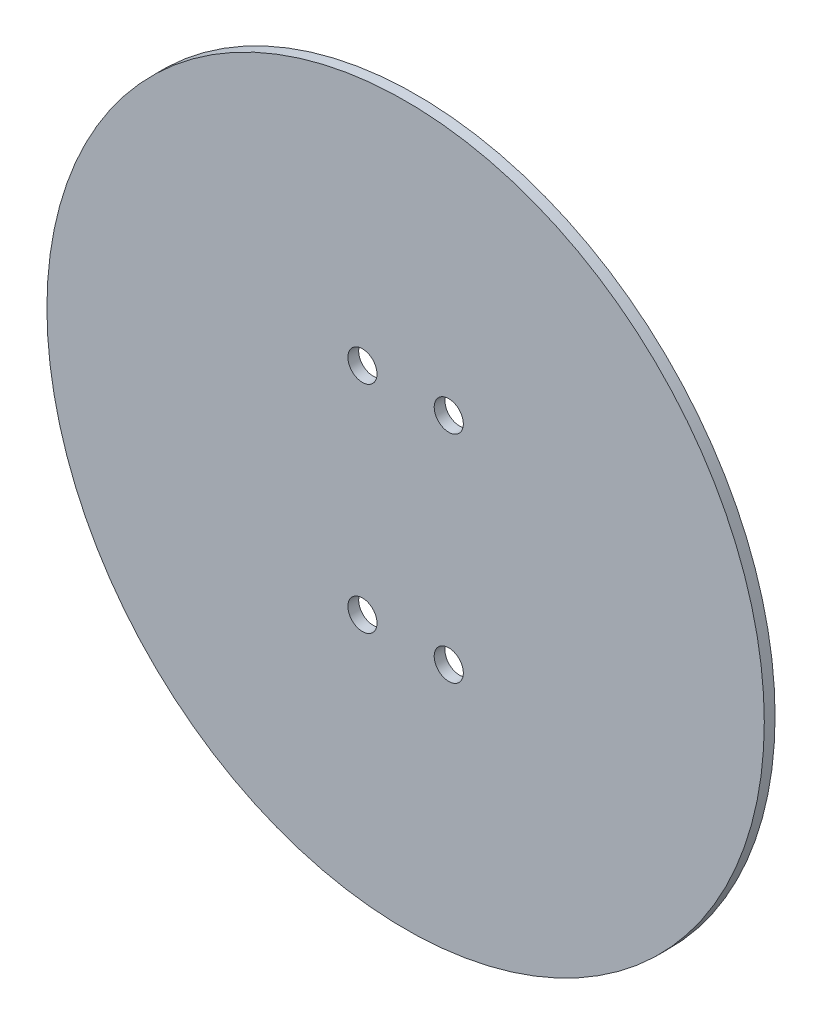
ISO-10303-21;
HEADER;
FILE_DESCRIPTION(('STEP AP214'),'2;1');
FILE_NAME('part.step','',(''),(''),'','','');
FILE_SCHEMA(('AUTOMOTIVE_DESIGN { 1 0 10303 214 1 1 1 1 }'));
ENDSEC;
DATA;
#1=APPLICATION_CONTEXT('core data for automotive mechanical design processes');
#2=APPLICATION_PROTOCOL_DEFINITION('international standard','automotive_design',2000,#1);
#3=PRODUCT_CONTEXT('',#1,'mechanical');
#4=PRODUCT('Part','Part','',(#3));
#5=PRODUCT_RELATED_PRODUCT_CATEGORY('part','',(#4));
#6=PRODUCT_DEFINITION_FORMATION('','',#4);
#7=PRODUCT_DEFINITION_CONTEXT('part definition',#1,'design');
#8=PRODUCT_DEFINITION('design','',#6,#7);
#9=PRODUCT_DEFINITION_SHAPE('','',#8);
#10=(LENGTH_UNIT() NAMED_UNIT(*) SI_UNIT(.MILLI.,.METRE.));
#11=(NAMED_UNIT(*) PLANE_ANGLE_UNIT() SI_UNIT($,.RADIAN.));
#12=(NAMED_UNIT(*) SI_UNIT($,.STERADIAN.) SOLID_ANGLE_UNIT());
#13=UNCERTAINTY_MEASURE_WITH_UNIT(LENGTH_MEASURE(1.E-05),#10,'distance_accuracy_value','');
#14=(GEOMETRIC_REPRESENTATION_CONTEXT(3) GLOBAL_UNCERTAINTY_ASSIGNED_CONTEXT((#13)) GLOBAL_UNIT_ASSIGNED_CONTEXT((#10,
#11,#12)) REPRESENTATION_CONTEXT('',''));
#15=CARTESIAN_POINT('',(0.,0.,0.));
#16=DIRECTION('',(0.,0.,1.));
#17=DIRECTION('',(1.,0.,0.));
#18=AXIS2_PLACEMENT_3D('',#15,#16,#17);
#19=CARTESIAN_POINT('',(0.,0.,2.54));
#20=DIRECTION('',(0.,0.,-1.));
#21=DIRECTION('',(-1.,0.,0.));
#22=AXIS2_PLACEMENT_3D('',#19,#20,#21);
#23=CYLINDRICAL_SURFACE('',#22,84.455);
#24=CARTESIAN_POINT('',(0.,0.,2.54));
#25=DIRECTION('',(0.,0.,1.));
#26=DIRECTION('',(1.,0.,0.));
#27=AXIS2_PLACEMENT_3D('',#24,#25,#26);
#28=CIRCLE('',#27,84.455);
#29=CARTESIAN_POINT('',(84.455,0.,2.54));
#30=VERTEX_POINT('',#29);
#31=EDGE_CURVE('E10',#30,#30,#28,.T.);
#32=ORIENTED_EDGE('',*,*,#31,.F.);
#33=EDGE_LOOP('',(#32));
#34=FACE_BOUND('',#33,.T.);
#35=CARTESIAN_POINT('',(0.,0.,0.));
#36=DIRECTION('',(0.,0.,1.));
#37=DIRECTION('',(1.,0.,0.));
#38=AXIS2_PLACEMENT_3D('',#35,#36,#37);
#39=CIRCLE('',#38,84.455);
#40=CARTESIAN_POINT('',(84.455,0.,0.));
#41=VERTEX_POINT('',#40);
#42=EDGE_CURVE('E46',#41,#41,#39,.T.);
#43=ORIENTED_EDGE('',*,*,#42,.T.);
#44=EDGE_LOOP('',(#43));
#45=FACE_BOUND('',#44,.T.);
#46=ADVANCED_FACE('F43',(#34,#45),#23,.T.);
#47=CARTESIAN_POINT('',(0.,0.,2.54));
#48=DIRECTION('',(0.,0.,1.));
#49=DIRECTION('',(1.,0.,0.));
#50=AXIS2_PLACEMENT_3D('',#47,#48,#49);
#51=PLANE('',#50);
#52=CARTESIAN_POINT('',(-10.16,-25.4,2.54));
#53=DIRECTION('',(0.,0.,1.));
#54=DIRECTION('',(-1.,0.,0.));
#55=AXIS2_PLACEMENT_3D('',#52,#53,#54);
#56=CIRCLE('',#55,3.429);
#57=CARTESIAN_POINT('',(-13.589,-25.4,2.54));
#58=VERTEX_POINT('',#57);
#59=EDGE_CURVE('E69',#58,#58,#56,.T.);
#60=ORIENTED_EDGE('',*,*,#59,.F.);
#61=EDGE_LOOP('',(#60));
#62=FACE_BOUND('',#61,.T.);
#63=CARTESIAN_POINT('',(10.16,-25.4,2.54));
#64=DIRECTION('',(0.,0.,1.));
#65=DIRECTION('',(1.,0.,0.));
#66=AXIS2_PLACEMENT_3D('',#63,#64,#65);
#67=CIRCLE('',#66,3.429);
#68=CARTESIAN_POINT('',(13.589,-25.4,2.54));
#69=VERTEX_POINT('',#68);
#70=EDGE_CURVE('E77',#69,#69,#67,.T.);
#71=ORIENTED_EDGE('',*,*,#70,.F.);
#72=EDGE_LOOP('',(#71));
#73=FACE_BOUND('',#72,.T.);
#74=CARTESIAN_POINT('',(10.16,25.4,2.54));
#75=DIRECTION('',(0.,0.,1.));
#76=DIRECTION('',(-1.,0.,0.));
#77=AXIS2_PLACEMENT_3D('',#74,#75,#76);
#78=CIRCLE('',#77,3.429);
#79=CARTESIAN_POINT('',(6.731,25.4,2.54));
#80=VERTEX_POINT('',#79);
#81=EDGE_CURVE('E61',#80,#80,#78,.T.);
#82=ORIENTED_EDGE('',*,*,#81,.F.);
#83=EDGE_LOOP('',(#82));
#84=FACE_BOUND('',#83,.T.);
#85=CARTESIAN_POINT('',(-10.16,25.4,2.54));
#86=DIRECTION('',(0.,0.,1.));
#87=DIRECTION('',(1.,0.,0.));
#88=AXIS2_PLACEMENT_3D('',#85,#86,#87);
#89=CIRCLE('',#88,3.429);
#90=CARTESIAN_POINT('',(-6.731,25.4,2.54));
#91=VERTEX_POINT('',#90);
#92=EDGE_CURVE('E57',#91,#91,#89,.T.);
#93=ORIENTED_EDGE('',*,*,#92,.F.);
#94=EDGE_LOOP('',(#93));
#95=FACE_BOUND('',#94,.T.);
#96=ORIENTED_EDGE('',*,*,#31,.T.);
#97=EDGE_LOOP('',(#96));
#98=FACE_BOUND('',#97,.T.);
#99=ADVANCED_FACE('F91',(#62,#73,#84,#95,#98),#51,.T.);
#100=CARTESIAN_POINT('',(0.,0.,0.));
#101=DIRECTION('',(0.,0.,1.));
#102=DIRECTION('',(1.,0.,0.));
#103=AXIS2_PLACEMENT_3D('',#100,#101,#102);
#104=PLANE('',#103);
#105=CARTESIAN_POINT('',(-10.16,-25.4,0.));
#106=DIRECTION('',(0.,0.,1.));
#107=DIRECTION('',(-1.,0.,0.));
#108=AXIS2_PLACEMENT_3D('',#105,#106,#107);
#109=CIRCLE('',#108,3.429);
#110=CARTESIAN_POINT('',(-13.589,-25.4,0.));
#111=VERTEX_POINT('',#110);
#112=EDGE_CURVE('E65',#111,#111,#109,.T.);
#113=ORIENTED_EDGE('',*,*,#112,.T.);
#114=EDGE_LOOP('',(#113));
#115=FACE_BOUND('',#114,.T.);
#116=CARTESIAN_POINT('',(10.16,-25.4,0.));
#117=DIRECTION('',(0.,0.,1.));
#118=DIRECTION('',(1.,0.,0.));
#119=AXIS2_PLACEMENT_3D('',#116,#117,#118);
#120=CIRCLE('',#119,3.429);
#121=CARTESIAN_POINT('',(13.589,-25.4,0.));
#122=VERTEX_POINT('',#121);
#123=EDGE_CURVE('E73',#122,#122,#120,.T.);
#124=ORIENTED_EDGE('',*,*,#123,.T.);
#125=EDGE_LOOP('',(#124));
#126=FACE_BOUND('',#125,.T.);
#127=CARTESIAN_POINT('',(10.16,25.4,0.));
#128=DIRECTION('',(0.,0.,1.));
#129=DIRECTION('',(-1.,0.,0.));
#130=AXIS2_PLACEMENT_3D('',#127,#128,#129);
#131=CIRCLE('',#130,3.429);
#132=CARTESIAN_POINT('',(6.731,25.4,0.));
#133=VERTEX_POINT('',#132);
#134=EDGE_CURVE('E81',#133,#133,#131,.T.);
#135=ORIENTED_EDGE('',*,*,#134,.T.);
#136=EDGE_LOOP('',(#135));
#137=FACE_BOUND('',#136,.T.);
#138=CARTESIAN_POINT('',(-10.16,25.4,0.));
#139=DIRECTION('',(0.,0.,1.));
#140=DIRECTION('',(1.,0.,0.));
#141=AXIS2_PLACEMENT_3D('',#138,#139,#140);
#142=CIRCLE('',#141,3.429);
#143=CARTESIAN_POINT('',(-6.731,25.4,0.));
#144=VERTEX_POINT('',#143);
#145=EDGE_CURVE('E55',#144,#144,#142,.T.);
#146=ORIENTED_EDGE('',*,*,#145,.T.);
#147=EDGE_LOOP('',(#146));
#148=FACE_BOUND('',#147,.T.);
#149=ORIENTED_EDGE('',*,*,#42,.F.);
#150=EDGE_LOOP('',(#149));
#151=FACE_BOUND('',#150,.T.);
#152=ADVANCED_FACE('F94',(#115,#126,#137,#148,#151),#104,.F.);
#153=CARTESIAN_POINT('',(-10.16,25.4,0.));
#154=DIRECTION('',(0.,0.,1.));
#155=DIRECTION('',(1.,0.,0.));
#156=AXIS2_PLACEMENT_3D('',#153,#154,#155);
#157=CYLINDRICAL_SURFACE('',#156,3.429);
#158=ORIENTED_EDGE('',*,*,#145,.F.);
#159=EDGE_LOOP('',(#158));
#160=FACE_BOUND('',#159,.T.);
#161=ORIENTED_EDGE('',*,*,#92,.T.);
#162=EDGE_LOOP('',(#161));
#163=FACE_BOUND('',#162,.T.);
#164=ADVANCED_FACE('F99',(#160,#163),#157,.F.);
#165=CARTESIAN_POINT('',(10.16,25.4,0.));
#166=DIRECTION('',(0.,0.,1.));
#167=DIRECTION('',(1.,0.,0.));
#168=AXIS2_PLACEMENT_3D('',#165,#166,#167);
#169=CYLINDRICAL_SURFACE('',#168,3.429);
#170=ORIENTED_EDGE('',*,*,#134,.F.);
#171=EDGE_LOOP('',(#170));
#172=FACE_BOUND('',#171,.T.);
#173=ORIENTED_EDGE('',*,*,#81,.T.);
#174=EDGE_LOOP('',(#173));
#175=FACE_BOUND('',#174,.T.);
#176=ADVANCED_FACE('F89',(#172,#175),#169,.F.);
#177=CARTESIAN_POINT('',(10.16,-25.4,0.));
#178=DIRECTION('',(0.,0.,1.));
#179=DIRECTION('',(1.,0.,0.));
#180=AXIS2_PLACEMENT_3D('',#177,#178,#179);
#181=CYLINDRICAL_SURFACE('',#180,3.429);
#182=ORIENTED_EDGE('',*,*,#123,.F.);
#183=EDGE_LOOP('',(#182));
#184=FACE_BOUND('',#183,.T.);
#185=ORIENTED_EDGE('',*,*,#70,.T.);
#186=EDGE_LOOP('',(#185));
#187=FACE_BOUND('',#186,.T.);
#188=ADVANCED_FACE('F107',(#184,#187),#181,.F.);
#189=CARTESIAN_POINT('',(-10.16,-25.4,0.));
#190=DIRECTION('',(0.,0.,1.));
#191=DIRECTION('',(1.,0.,0.));
#192=AXIS2_PLACEMENT_3D('',#189,#190,#191);
#193=CYLINDRICAL_SURFACE('',#192,3.429);
#194=ORIENTED_EDGE('',*,*,#112,.F.);
#195=EDGE_LOOP('',(#194));
#196=FACE_BOUND('',#195,.T.);
#197=ORIENTED_EDGE('',*,*,#59,.T.);
#198=EDGE_LOOP('',(#197));
#199=FACE_BOUND('',#198,.T.);
#200=ADVANCED_FACE('F150',(#196,#199),#193,.F.);
#201=CLOSED_SHELL('',(#46,#99,#152,#164,#176,#188,#200));
#202=MANIFOLD_SOLID_BREP('B2',#201);
#203=ADVANCED_BREP_SHAPE_REPRESENTATION('',(#18,#202),#14);
#204=SHAPE_DEFINITION_REPRESENTATION(#9,#203);
ENDSEC;
END-ISO-10303-21;
